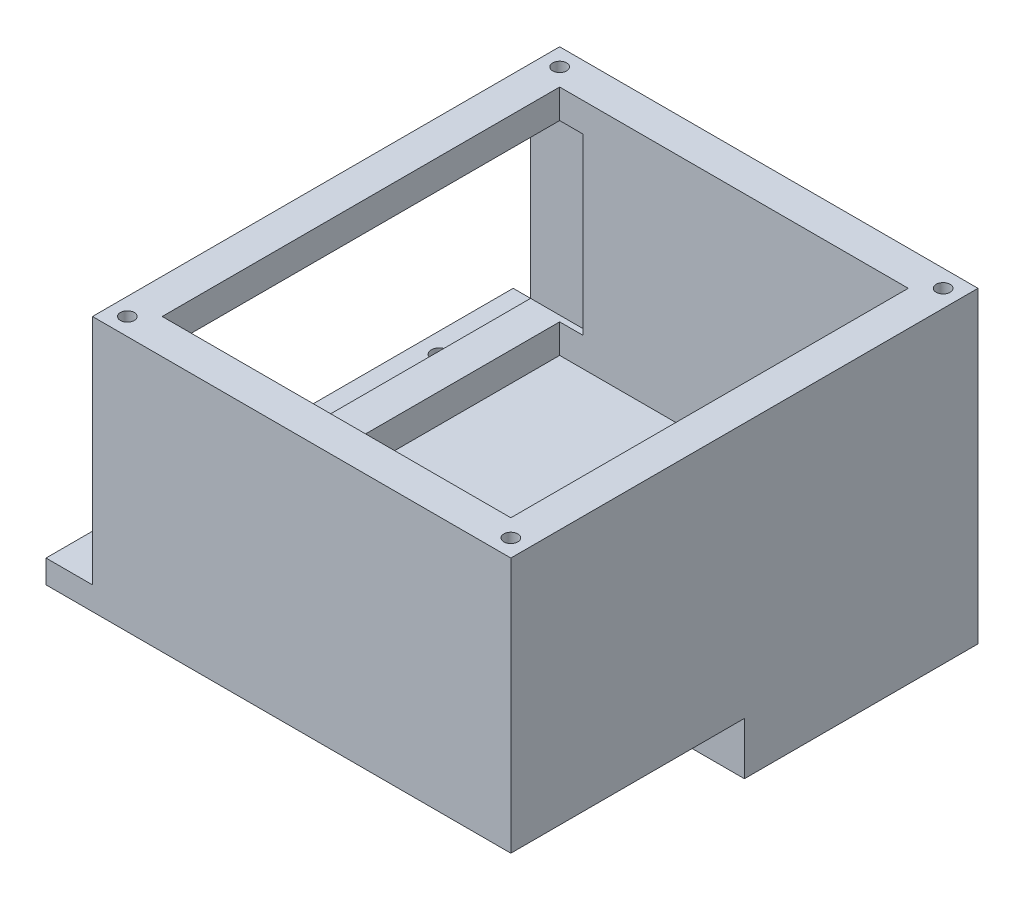
ISO-10303-21;
HEADER;
FILE_DESCRIPTION(('STEP AP214'),'2;1');
FILE_NAME('part.step','',(''),(''),'','','');
FILE_SCHEMA(('AUTOMOTIVE_DESIGN { 1 0 10303 214 1 1 1 1 }'));
ENDSEC;
DATA;
#1=APPLICATION_CONTEXT('core data for automotive mechanical design processes');
#2=APPLICATION_PROTOCOL_DEFINITION('international standard','automotive_design',2000,#1);
#3=PRODUCT_CONTEXT('',#1,'mechanical');
#4=PRODUCT('Part','Part','',(#3));
#5=PRODUCT_RELATED_PRODUCT_CATEGORY('part','',(#4));
#6=PRODUCT_DEFINITION_FORMATION('','',#4);
#7=PRODUCT_DEFINITION_CONTEXT('part definition',#1,'design');
#8=PRODUCT_DEFINITION('design','',#6,#7);
#9=PRODUCT_DEFINITION_SHAPE('','',#8);
#10=(LENGTH_UNIT() NAMED_UNIT(*) SI_UNIT(.MILLI.,.METRE.));
#11=(NAMED_UNIT(*) PLANE_ANGLE_UNIT() SI_UNIT($,.RADIAN.));
#12=(NAMED_UNIT(*) SI_UNIT($,.STERADIAN.) SOLID_ANGLE_UNIT());
#13=UNCERTAINTY_MEASURE_WITH_UNIT(LENGTH_MEASURE(1.E-05),#10,'distance_accuracy_value','');
#14=(GEOMETRIC_REPRESENTATION_CONTEXT(3) GLOBAL_UNCERTAINTY_ASSIGNED_CONTEXT((#13)) GLOBAL_UNIT_ASSIGNED_CONTEXT((#10,
#11,#12)) REPRESENTATION_CONTEXT('',''));
#15=CARTESIAN_POINT('',(0.,0.,0.));
#16=DIRECTION('',(0.,0.,1.));
#17=DIRECTION('',(1.,0.,0.));
#18=AXIS2_PLACEMENT_3D('',#15,#16,#17);
#19=CARTESIAN_POINT('',(0.,0.,0.));
#20=DIRECTION('',(0.,-1.,0.));
#21=DIRECTION('',(0.,0.,-1.));
#22=AXIS2_PLACEMENT_3D('',#19,#20,#21);
#23=PLANE('',#22);
#24=CARTESIAN_POINT('',(-36.5,0.,24.));
#25=DIRECTION('',(0.,-1.,0.));
#26=DIRECTION('',(0.,0.,-1.));
#27=AXIS2_PLACEMENT_3D('',#24,#25,#26);
#28=CIRCLE('',#27,1.375);
#29=CARTESIAN_POINT('',(-36.5,0.,22.625));
#30=VERTEX_POINT('',#29);
#31=EDGE_CURVE('E526',#30,#30,#28,.T.);
#32=ORIENTED_EDGE('',*,*,#31,.F.);
#33=EDGE_LOOP('',(#32));
#34=FACE_BOUND('',#33,.T.);
#35=CARTESIAN_POINT('',(-36.5,0.,-24.));
#36=DIRECTION('',(0.,-1.,0.));
#37=DIRECTION('',(0.,0.,-1.));
#38=AXIS2_PLACEMENT_3D('',#35,#36,#37);
#39=CIRCLE('',#38,1.375);
#40=CARTESIAN_POINT('',(-36.5,0.,-25.375));
#41=VERTEX_POINT('',#40);
#42=EDGE_CURVE('E521',#41,#41,#39,.T.);
#43=ORIENTED_EDGE('',*,*,#42,.F.);
#44=EDGE_LOOP('',(#43));
#45=FACE_BOUND('',#44,.T.);
#46=DIRECTION('',(-1.,0.,0.));
#47=VECTOR('',#46,1.);
#48=CARTESIAN_POINT('',(-40.,0.,-40.2));
#49=LINE('',#48,#47);
#50=CARTESIAN_POINT('',(-32.4,0.,-40.2));
#51=VERTEX_POINT('',#50);
#52=CARTESIAN_POINT('',(-40.,0.,-40.2));
#53=VERTEX_POINT('',#52);
#54=EDGE_CURVE('E576',#51,#53,#49,.T.);
#55=ORIENTED_EDGE('',*,*,#54,.F.);
#56=DIRECTION('',(0.,0.,1.));
#57=VECTOR('',#56,1.);
#58=CARTESIAN_POINT('',(-32.4,0.,-1.03129053738735E-13));
#59=LINE('',#58,#57);
#60=CARTESIAN_POINT('',(-32.4,0.,0.));
#61=VERTEX_POINT('',#60);
#62=EDGE_CURVE('E615',#51,#61,#59,.T.);
#63=ORIENTED_EDGE('',*,*,#62,.T.);
#64=DIRECTION('',(1.,0.,0.));
#65=VECTOR('',#64,1.);
#66=CARTESIAN_POINT('',(0.,0.,0.));
#67=LINE('',#66,#65);
#68=CARTESIAN_POINT('',(-32.,0.,0.));
#69=VERTEX_POINT('',#68);
#70=EDGE_CURVE('E612',#61,#69,#67,.T.);
#71=ORIENTED_EDGE('',*,*,#70,.T.);
#72=DIRECTION('',(0.,0.,1.));
#73=VECTOR('',#72,1.);
#74=CARTESIAN_POINT('',(-32.,0.,0.));
#75=LINE('',#74,#73);
#76=CARTESIAN_POINT('',(-32.,0.,35.2));
#77=VERTEX_POINT('',#76);
#78=EDGE_CURVE('E329',#69,#77,#75,.T.);
#79=ORIENTED_EDGE('',*,*,#78,.T.);
#80=DIRECTION('',(1.,0.,0.));
#81=VECTOR('',#80,1.);
#82=CARTESIAN_POINT('',(-27.,0.,35.2));
#83=LINE('',#82,#81);
#84=CARTESIAN_POINT('',(35.,0.,35.2));
#85=VERTEX_POINT('',#84);
#86=EDGE_CURVE('E492',#77,#85,#83,.T.);
#87=ORIENTED_EDGE('',*,*,#86,.T.);
#88=DIRECTION('',(0.,0.,-1.));
#89=VECTOR('',#88,1.);
#90=CARTESIAN_POINT('',(35.,0.,35.2));
#91=LINE('',#90,#89);
#92=CARTESIAN_POINT('',(35.,0.,0.));
#93=VERTEX_POINT('',#92);
#94=EDGE_CURVE('E497',#85,#93,#91,.T.);
#95=ORIENTED_EDGE('',*,*,#94,.T.);
#96=DIRECTION('',(-1.,0.,0.));
#97=VECTOR('',#96,1.);
#98=CARTESIAN_POINT('',(0.,0.,0.));
#99=LINE('',#98,#97);
#100=CARTESIAN_POINT('',(40.,0.,0.));
#101=VERTEX_POINT('',#100);
#102=EDGE_CURVE('E530',#101,#93,#99,.T.);
#103=ORIENTED_EDGE('',*,*,#102,.F.);
#104=DIRECTION('',(0.,0.,-1.));
#105=VECTOR('',#104,1.);
#106=CARTESIAN_POINT('',(40.,0.,40.2));
#107=LINE('',#106,#105);
#108=CARTESIAN_POINT('',(40.,0.,40.2));
#109=VERTEX_POINT('',#108);
#110=EDGE_CURVE('E560',#109,#101,#107,.T.);
#111=ORIENTED_EDGE('',*,*,#110,.F.);
#112=DIRECTION('',(1.,0.,0.));
#113=VECTOR('',#112,1.);
#114=CARTESIAN_POINT('',(-40.,0.,40.2));
#115=LINE('',#114,#113);
#116=CARTESIAN_POINT('',(-40.,0.,40.2));
#117=VERTEX_POINT('',#116);
#118=EDGE_CURVE('E565',#117,#109,#115,.T.);
#119=ORIENTED_EDGE('',*,*,#118,.F.);
#120=DIRECTION('',(0.,0.,1.));
#121=VECTOR('',#120,1.);
#122=CARTESIAN_POINT('',(-40.,0.,40.2));
#123=LINE('',#122,#121);
#124=EDGE_CURVE('E579',#53,#117,#123,.T.);
#125=ORIENTED_EDGE('',*,*,#124,.F.);
#126=EDGE_LOOP('',(#55,#63,#71,#79,#87,#95,#103,#111,#119,#125));
#127=FACE_BOUND('',#126,.T.);
#128=ADVANCED_FACE('F111',(#34,#45,#127),#23,.T.);
#129=CARTESIAN_POINT('',(0.,4.,0.));
#130=DIRECTION('',(0.,1.,0.));
#131=DIRECTION('',(0.,0.,1.));
#132=AXIS2_PLACEMENT_3D('',#129,#130,#131);
#133=PLANE('',#132);
#134=DIRECTION('',(0.,0.,1.));
#135=VECTOR('',#134,1.);
#136=CARTESIAN_POINT('',(-23.9814920279926,4.,0.));
#137=LINE('',#136,#135);
#138=CARTESIAN_POINT('',(-23.9814920279926,4.,34.2));
#139=VERTEX_POINT('',#138);
#140=CARTESIAN_POINT('',(-23.9814920279926,4.,35.2));
#141=VERTEX_POINT('',#140);
#142=EDGE_CURVE('E661',#139,#141,#137,.T.);
#143=ORIENTED_EDGE('',*,*,#142,.F.);
#144=DIRECTION('',(-1.,0.,0.));
#145=VECTOR('',#144,1.);
#146=CARTESIAN_POINT('',(34.,4.,34.2));
#147=LINE('',#146,#145);
#148=CARTESIAN_POINT('',(34.,4.,34.2));
#149=VERTEX_POINT('',#148);
#150=EDGE_CURVE('E413',#149,#139,#147,.T.);
#151=ORIENTED_EDGE('',*,*,#150,.F.);
#152=DIRECTION('',(0.,0.,1.));
#153=VECTOR('',#152,1.);
#154=CARTESIAN_POINT('',(34.,4.,34.2));
#155=LINE('',#154,#153);
#156=CARTESIAN_POINT('',(34.,4.,0.));
#157=VERTEX_POINT('',#156);
#158=EDGE_CURVE('E448',#157,#149,#155,.T.);
#159=ORIENTED_EDGE('',*,*,#158,.F.);
#160=DIRECTION('',(1.,0.,0.));
#161=VECTOR('',#160,1.);
#162=CARTESIAN_POINT('',(-27.,4.,0.));
#163=LINE('',#162,#161);
#164=CARTESIAN_POINT('',(35.,4.,0.));
#165=VERTEX_POINT('',#164);
#166=EDGE_CURVE('E501',#157,#165,#163,.T.);
#167=ORIENTED_EDGE('',*,*,#166,.T.);
#168=DIRECTION('',(0.,0.,-1.));
#169=VECTOR('',#168,1.);
#170=CARTESIAN_POINT('',(35.,4.,35.2));
#171=LINE('',#170,#169);
#172=CARTESIAN_POINT('',(35.,4.,35.2));
#173=VERTEX_POINT('',#172);
#174=EDGE_CURVE('E506',#173,#165,#171,.T.);
#175=ORIENTED_EDGE('',*,*,#174,.F.);
#176=DIRECTION('',(1.,0.,0.));
#177=VECTOR('',#176,1.);
#178=CARTESIAN_POINT('',(-27.,4.,35.2));
#179=LINE('',#178,#177);
#180=EDGE_CURVE('E510',#141,#173,#179,.T.);
#181=ORIENTED_EDGE('',*,*,#180,.F.);
#182=EDGE_LOOP('',(#143,#151,#159,#167,#175,#181));
#183=FACE_BOUND('',#182,.T.);
#184=ADVANCED_FACE('F716',(#183),#133,.F.);
#185=CARTESIAN_POINT('',(-32.,44.,40.2));
#186=DIRECTION('',(-1.,0.,0.));
#187=DIRECTION('',(0.,0.,1.));
#188=AXIS2_PLACEMENT_3D('',#185,#186,#187);
#189=PLANE('',#188);
#190=DIRECTION('',(0.,-1.,0.));
#191=VECTOR('',#190,1.);
#192=CARTESIAN_POINT('',(-32.,44.,-40.2));
#193=LINE('',#192,#191);
#194=CARTESIAN_POINT('',(-32.,44.,-40.2));
#195=VERTEX_POINT('',#194);
#196=CARTESIAN_POINT('',(-32.,6.4,-40.2));
#197=VERTEX_POINT('',#196);
#198=EDGE_CURVE('E489',#195,#197,#193,.T.);
#199=ORIENTED_EDGE('',*,*,#198,.T.);
#200=DIRECTION('',(0.,0.,-1.));
#201=VECTOR('',#200,1.);
#202=CARTESIAN_POINT('',(-32.,6.4,40.2));
#203=LINE('',#202,#201);
#204=CARTESIAN_POINT('',(-32.,6.4,0.));
#205=VERTEX_POINT('',#204);
#206=EDGE_CURVE('E315',#197,#205,#203,.F.);
#207=ORIENTED_EDGE('',*,*,#206,.T.);
#208=DIRECTION('',(0.,1.,0.));
#209=VECTOR('',#208,1.);
#210=CARTESIAN_POINT('',(-32.,-8.,0.));
#211=LINE('',#210,#209);
#212=CARTESIAN_POINT('',(-32.,9.,0.));
#213=VERTEX_POINT('',#212);
#214=EDGE_CURVE('E308',#205,#213,#211,.T.);
#215=ORIENTED_EDGE('',*,*,#214,.T.);
#216=DIRECTION('',(0.,0.,1.));
#217=VECTOR('',#216,1.);
#218=CARTESIAN_POINT('',(-32.,9.,-35.2));
#219=LINE('',#218,#217);
#220=CARTESIAN_POINT('',(-32.,9.,-35.2));
#221=VERTEX_POINT('',#220);
#222=EDGE_CURVE('E313',#221,#213,#219,.T.);
#223=ORIENTED_EDGE('',*,*,#222,.F.);
#224=DIRECTION('',(0.,-1.,0.));
#225=VECTOR('',#224,1.);
#226=CARTESIAN_POINT('',(-32.,39.,-35.2));
#227=LINE('',#226,#225);
#228=CARTESIAN_POINT('',(-32.,39.,-35.2));
#229=VERTEX_POINT('',#228);
#230=EDGE_CURVE('E338',#229,#221,#227,.T.);
#231=ORIENTED_EDGE('',*,*,#230,.F.);
#232=DIRECTION('',(0.,0.,-1.));
#233=VECTOR('',#232,1.);
#234=CARTESIAN_POINT('',(-32.,39.,35.2));
#235=LINE('',#234,#233);
#236=CARTESIAN_POINT('',(-32.,39.,35.2));
#237=VERTEX_POINT('',#236);
#238=EDGE_CURVE('E343',#237,#229,#235,.T.);
#239=ORIENTED_EDGE('',*,*,#238,.F.);
#240=DIRECTION('',(0.,1.,0.));
#241=VECTOR('',#240,1.);
#242=CARTESIAN_POINT('',(-32.,9.,35.2));
#243=LINE('',#242,#241);
#244=CARTESIAN_POINT('',(-32.,4.,35.2));
#245=VERTEX_POINT('',#244);
#246=EDGE_CURVE('E337',#245,#237,#243,.T.);
#247=ORIENTED_EDGE('',*,*,#246,.F.);
#248=DIRECTION('',(0.,0.,-1.));
#249=VECTOR('',#248,1.);
#250=CARTESIAN_POINT('',(-32.,4.,40.2));
#251=LINE('',#250,#249);
#252=CARTESIAN_POINT('',(-32.,4.,40.2));
#253=VERTEX_POINT('',#252);
#254=EDGE_CURVE('E456',#253,#245,#251,.T.);
#255=ORIENTED_EDGE('',*,*,#254,.F.);
#256=DIRECTION('',(0.,-1.,0.));
#257=VECTOR('',#256,1.);
#258=CARTESIAN_POINT('',(-32.,44.,40.2));
#259=LINE('',#258,#257);
#260=CARTESIAN_POINT('',(-32.,44.,40.2));
#261=VERTEX_POINT('',#260);
#262=EDGE_CURVE('E485',#261,#253,#259,.T.);
#263=ORIENTED_EDGE('',*,*,#262,.F.);
#264=DIRECTION('',(0.,0.,-1.));
#265=VECTOR('',#264,1.);
#266=CARTESIAN_POINT('',(-32.,44.,40.2));
#267=LINE('',#266,#265);
#268=EDGE_CURVE('E477',#261,#195,#267,.T.);
#269=ORIENTED_EDGE('',*,*,#268,.T.);
#270=EDGE_LOOP('',(#199,#207,#215,#223,#231,#239,#247,#255,#263,#269));
#271=FACE_BOUND('',#270,.T.);
#272=ADVANCED_FACE('F310',(#271),#189,.T.);
#273=CARTESIAN_POINT('',(34.,44.,34.2));
#274=DIRECTION('',(0.,0.,1.));
#275=DIRECTION('',(1.,0.,0.));
#276=AXIS2_PLACEMENT_3D('',#273,#274,#275);
#277=PLANE('',#276);
#278=DIRECTION('',(0.,-1.,0.));
#279=VECTOR('',#278,1.);
#280=CARTESIAN_POINT('',(-23.9814920279926,44.,34.2));
#281=LINE('',#280,#279);
#282=CARTESIAN_POINT('',(-23.9814920279926,9.,34.2));
#283=VERTEX_POINT('',#282);
#284=EDGE_CURVE('E664',#283,#139,#281,.T.);
#285=ORIENTED_EDGE('',*,*,#284,.F.);
#286=DIRECTION('',(1.,0.,0.));
#287=VECTOR('',#286,1.);
#288=CARTESIAN_POINT('',(34.,9.,34.2));
#289=LINE('',#288,#287);
#290=CARTESIAN_POINT('',(-22.,9.,34.2));
#291=VERTEX_POINT('',#290);
#292=EDGE_CURVE('E369',#283,#291,#289,.T.);
#293=ORIENTED_EDGE('',*,*,#292,.T.);
#294=DIRECTION('',(0.,-1.,0.));
#295=VECTOR('',#294,1.);
#296=CARTESIAN_POINT('',(-22.,44.,34.2));
#297=LINE('',#296,#295);
#298=CARTESIAN_POINT('',(-22.,39.,34.2));
#299=VERTEX_POINT('',#298);
#300=EDGE_CURVE('E380',#299,#291,#297,.T.);
#301=ORIENTED_EDGE('',*,*,#300,.F.);
#302=DIRECTION('',(-1.,0.,0.));
#303=VECTOR('',#302,1.);
#304=CARTESIAN_POINT('',(34.,39.,34.2));
#305=LINE('',#304,#303);
#306=CARTESIAN_POINT('',(-26.,39.,34.2));
#307=VERTEX_POINT('',#306);
#308=EDGE_CURVE('E376',#299,#307,#305,.T.);
#309=ORIENTED_EDGE('',*,*,#308,.T.);
#310=DIRECTION('',(0.,-1.,0.));
#311=VECTOR('',#310,1.);
#312=CARTESIAN_POINT('',(-26.,44.,34.2));
#313=LINE('',#312,#311);
#314=CARTESIAN_POINT('',(-26.,44.,34.2));
#315=VERTEX_POINT('',#314);
#316=EDGE_CURVE('E434',#315,#307,#313,.T.);
#317=ORIENTED_EDGE('',*,*,#316,.F.);
#318=DIRECTION('',(-1.,0.,0.));
#319=VECTOR('',#318,1.);
#320=CARTESIAN_POINT('',(34.,44.,34.2));
#321=LINE('',#320,#319);
#322=CARTESIAN_POINT('',(34.,44.,34.2));
#323=VERTEX_POINT('',#322);
#324=EDGE_CURVE('E417',#323,#315,#321,.T.);
#325=ORIENTED_EDGE('',*,*,#324,.F.);
#326=DIRECTION('',(0.,-1.,0.));
#327=VECTOR('',#326,1.);
#328=CARTESIAN_POINT('',(34.,44.,34.2));
#329=LINE('',#328,#327);
#330=EDGE_CURVE('E452',#323,#149,#329,.T.);
#331=ORIENTED_EDGE('',*,*,#330,.T.);
#332=ORIENTED_EDGE('',*,*,#150,.T.);
#333=EDGE_LOOP('',(#285,#293,#301,#309,#317,#325,#331,#332));
#334=FACE_BOUND('',#333,.T.);
#335=ADVANCED_FACE('F701',(#334),#277,.F.);
#336=CARTESIAN_POINT('',(-26.,44.,34.2));
#337=DIRECTION('',(-1.,0.,0.));
#338=DIRECTION('',(0.,0.,1.));
#339=AXIS2_PLACEMENT_3D('',#336,#337,#338);
#340=PLANE('',#339);
#341=DIRECTION('',(0.,1.,0.));
#342=VECTOR('',#341,1.);
#343=CARTESIAN_POINT('',(-26.,44.,0.));
#344=LINE('',#343,#342);
#345=CARTESIAN_POINT('',(-26.,4.,0.));
#346=VERTEX_POINT('',#345);
#347=CARTESIAN_POINT('',(-26.,9.,0.));
#348=VERTEX_POINT('',#347);
#349=EDGE_CURVE('E325',#346,#348,#344,.T.);
#350=ORIENTED_EDGE('',*,*,#349,.F.);
#351=DIRECTION('',(0.,0.,-1.));
#352=VECTOR('',#351,1.);
#353=CARTESIAN_POINT('',(-26.,4.,34.2));
#354=LINE('',#353,#352);
#355=CARTESIAN_POINT('',(-26.,4.,-34.2));
#356=VERTEX_POINT('',#355);
#357=EDGE_CURVE('E439',#346,#356,#354,.T.);
#358=ORIENTED_EDGE('',*,*,#357,.T.);
#359=DIRECTION('',(0.,-1.,0.));
#360=VECTOR('',#359,1.);
#361=CARTESIAN_POINT('',(-26.,44.,-34.2));
#362=LINE('',#361,#360);
#363=CARTESIAN_POINT('',(-26.,9.,-34.2));
#364=VERTEX_POINT('',#363);
#365=EDGE_CURVE('E465',#364,#356,#362,.T.);
#366=ORIENTED_EDGE('',*,*,#365,.F.);
#367=DIRECTION('',(0.,0.,1.));
#368=VECTOR('',#367,1.);
#369=CARTESIAN_POINT('',(-26.,9.,34.2));
#370=LINE('',#369,#368);
#371=EDGE_CURVE('E443',#364,#348,#370,.T.);
#372=ORIENTED_EDGE('',*,*,#371,.T.);
#373=EDGE_LOOP('',(#350,#358,#366,#372));
#374=FACE_BOUND('',#373,.T.);
#375=ADVANCED_FACE('F824',(#374),#340,.F.);
#376=CARTESIAN_POINT('',(-22.,9.,-35.2));
#377=DIRECTION('',(0.,-1.,0.));
#378=DIRECTION('',(0.,0.,-1.));
#379=AXIS2_PLACEMENT_3D('',#376,#377,#378);
#380=PLANE('',#379);
#381=DIRECTION('',(1.,0.,0.));
#382=VECTOR('',#381,1.);
#383=CARTESIAN_POINT('',(0.,9.,0.));
#384=LINE('',#383,#382);
#385=EDGE_CURVE('E322',#213,#348,#384,.T.);
#386=ORIENTED_EDGE('',*,*,#385,.T.);
#387=ORIENTED_EDGE('',*,*,#371,.F.);
#388=DIRECTION('',(-1.,0.,0.));
#389=VECTOR('',#388,1.);
#390=CARTESIAN_POINT('',(34.,9.,-34.2));
#391=LINE('',#390,#389);
#392=CARTESIAN_POINT('',(-22.,9.,-34.2));
#393=VERTEX_POINT('',#392);
#394=EDGE_CURVE('E355',#393,#364,#391,.T.);
#395=ORIENTED_EDGE('',*,*,#394,.F.);
#396=DIRECTION('',(0.,0.,1.));
#397=VECTOR('',#396,1.);
#398=CARTESIAN_POINT('',(-22.,9.,-35.2));
#399=LINE('',#398,#397);
#400=CARTESIAN_POINT('',(-22.,9.,-35.2));
#401=VERTEX_POINT('',#400);
#402=EDGE_CURVE('E647',#401,#393,#399,.T.);
#403=ORIENTED_EDGE('',*,*,#402,.F.);
#404=DIRECTION('',(-1.,0.,0.));
#405=VECTOR('',#404,1.);
#406=CARTESIAN_POINT('',(-22.,9.,-35.2));
#407=LINE('',#406,#405);
#408=EDGE_CURVE('E335',#401,#221,#407,.T.);
#409=ORIENTED_EDGE('',*,*,#408,.T.);
#410=ORIENTED_EDGE('',*,*,#222,.T.);
#411=EDGE_LOOP('',(#386,#387,#395,#403,#409,#410));
#412=FACE_BOUND('',#411,.T.);
#413=ADVANCED_FACE('F333',(#412),#380,.F.);
#414=DIRECTION('',(0.,0.,1.));
#415=VECTOR('',#414,1.);
#416=CARTESIAN_POINT('',(-23.9814920279926,9.,0.));
#417=LINE('',#416,#415);
#418=CARTESIAN_POINT('',(-23.9814920279926,9.,35.2));
#419=VERTEX_POINT('',#418);
#420=EDGE_CURVE('E330',#283,#419,#417,.T.);
#421=ORIENTED_EDGE('',*,*,#420,.T.);
#422=DIRECTION('',(-1.,0.,0.));
#423=VECTOR('',#422,1.);
#424=CARTESIAN_POINT('',(-22.,9.,35.2));
#425=LINE('',#424,#423);
#426=CARTESIAN_POINT('',(-22.,9.,35.2));
#427=VERTEX_POINT('',#426);
#428=EDGE_CURVE('E359',#427,#419,#425,.T.);
#429=ORIENTED_EDGE('',*,*,#428,.F.);
#430=EDGE_CURVE('E651',#291,#427,#399,.T.);
#431=ORIENTED_EDGE('',*,*,#430,.F.);
#432=ORIENTED_EDGE('',*,*,#292,.F.);
#433=EDGE_LOOP('',(#421,#429,#431,#432));
#434=FACE_BOUND('',#433,.T.);
#435=ADVANCED_FACE('F685',(#434),#380,.F.);
#436=ORIENTED_EDGE('',*,*,#316,.T.);
#437=DIRECTION('',(0.,0.,-1.));
#438=VECTOR('',#437,1.);
#439=CARTESIAN_POINT('',(-26.,39.,34.2));
#440=LINE('',#439,#438);
#441=CARTESIAN_POINT('',(-26.,39.,-34.2));
#442=VERTEX_POINT('',#441);
#443=EDGE_CURVE('E605',#307,#442,#440,.T.);
#444=ORIENTED_EDGE('',*,*,#443,.T.);
#445=CARTESIAN_POINT('',(-26.,44.,-34.2));
#446=VERTEX_POINT('',#445);
#447=EDGE_CURVE('E461',#446,#442,#362,.T.);
#448=ORIENTED_EDGE('',*,*,#447,.F.);
#449=DIRECTION('',(0.,0.,-1.));
#450=VECTOR('',#449,1.);
#451=CARTESIAN_POINT('',(-26.,44.,34.2));
#452=LINE('',#451,#450);
#453=EDGE_CURVE('E421',#315,#446,#452,.T.);
#454=ORIENTED_EDGE('',*,*,#453,.F.);
#455=EDGE_LOOP('',(#436,#444,#448,#454));
#456=FACE_BOUND('',#455,.T.);
#457=ADVANCED_FACE('F705',(#456),#340,.F.);
#458=CARTESIAN_POINT('',(0.,4.,0.));
#459=DIRECTION('',(0.,-1.,0.));
#460=DIRECTION('',(0.,0.,-1.));
#461=AXIS2_PLACEMENT_3D('',#458,#459,#460);
#462=PLANE('',#461);
#463=ORIENTED_EDGE('',*,*,#357,.F.);
#464=EDGE_CURVE('E505',#346,#157,#163,.T.);
#465=ORIENTED_EDGE('',*,*,#464,.T.);
#466=CARTESIAN_POINT('',(34.,4.,-34.2));
#467=VERTEX_POINT('',#466);
#468=EDGE_CURVE('E422',#467,#157,#155,.T.);
#469=ORIENTED_EDGE('',*,*,#468,.F.);
#470=DIRECTION('',(1.,0.,0.));
#471=VECTOR('',#470,1.);
#472=CARTESIAN_POINT('',(34.,4.,-34.2));
#473=LINE('',#472,#471);
#474=EDGE_CURVE('E438',#356,#467,#473,.T.);
#475=ORIENTED_EDGE('',*,*,#474,.F.);
#476=EDGE_LOOP('',(#463,#465,#469,#475));
#477=FACE_BOUND('',#476,.T.);
#478=ADVANCED_FACE('F979',(#477),#462,.F.);
#479=DIRECTION('',(-1.,0.,0.));
#480=VECTOR('',#479,1.);
#481=CARTESIAN_POINT('',(0.,4.,0.));
#482=LINE('',#481,#480);
#483=CARTESIAN_POINT('',(-32.,4.,0.));
#484=VERTEX_POINT('',#483);
#485=CARTESIAN_POINT('',(-34.4,4.,0.));
#486=VERTEX_POINT('',#485);
#487=EDGE_CURVE('E126',#484,#486,#482,.T.);
#488=ORIENTED_EDGE('',*,*,#487,.T.);
#489=DIRECTION('',(0.,0.,-1.));
#490=VECTOR('',#489,1.);
#491=CARTESIAN_POINT('',(-34.4,4.,0.));
#492=LINE('',#491,#490);
#493=CARTESIAN_POINT('',(-34.4,4.,-40.2));
#494=VERTEX_POINT('',#493);
#495=EDGE_CURVE('E624',#486,#494,#492,.T.);
#496=ORIENTED_EDGE('',*,*,#495,.T.);
#497=DIRECTION('',(-1.,0.,0.));
#498=VECTOR('',#497,1.);
#499=CARTESIAN_POINT('',(-40.,4.,-40.2));
#500=LINE('',#499,#498);
#501=CARTESIAN_POINT('',(-40.,4.,-40.2));
#502=VERTEX_POINT('',#501);
#503=EDGE_CURVE('E561',#494,#502,#500,.T.);
#504=ORIENTED_EDGE('',*,*,#503,.T.);
#505=DIRECTION('',(0.,0.,1.));
#506=VECTOR('',#505,1.);
#507=CARTESIAN_POINT('',(-40.,4.,40.2));
#508=LINE('',#507,#506);
#509=CARTESIAN_POINT('',(-40.,4.,40.2));
#510=VERTEX_POINT('',#509);
#511=EDGE_CURVE('E564',#502,#510,#508,.T.);
#512=ORIENTED_EDGE('',*,*,#511,.T.);
#513=DIRECTION('',(1.,0.,0.));
#514=VECTOR('',#513,1.);
#515=CARTESIAN_POINT('',(-40.,4.,40.2));
#516=LINE('',#515,#514);
#517=EDGE_CURVE('E568',#510,#253,#516,.T.);
#518=ORIENTED_EDGE('',*,*,#517,.T.);
#519=ORIENTED_EDGE('',*,*,#254,.T.);
#520=DIRECTION('',(0.,0.,1.));
#521=VECTOR('',#520,1.);
#522=CARTESIAN_POINT('',(-32.,4.,0.));
#523=LINE('',#522,#521);
#524=EDGE_CURVE('E667',#484,#245,#523,.T.);
#525=ORIENTED_EDGE('',*,*,#524,.F.);
#526=EDGE_LOOP('',(#488,#496,#504,#512,#518,#519,#525));
#527=FACE_BOUND('',#526,.T.);
#528=CARTESIAN_POINT('',(-36.5,4.,-24.));
#529=DIRECTION('',(0.,-1.,0.));
#530=DIRECTION('',(0.,0.,-1.));
#531=AXIS2_PLACEMENT_3D('',#528,#529,#530);
#532=CIRCLE('',#531,1.375);
#533=CARTESIAN_POINT('',(-36.5,4.,-25.375));
#534=VERTEX_POINT('',#533);
#535=EDGE_CURVE('E520',#534,#534,#532,.T.);
#536=ORIENTED_EDGE('',*,*,#535,.T.);
#537=EDGE_LOOP('',(#536));
#538=FACE_BOUND('',#537,.T.);
#539=CARTESIAN_POINT('',(-36.5,4.,24.));
#540=DIRECTION('',(0.,-1.,0.));
#541=DIRECTION('',(0.,0.,-1.));
#542=AXIS2_PLACEMENT_3D('',#539,#540,#541);
#543=CIRCLE('',#542,1.375);
#544=CARTESIAN_POINT('',(-36.5,4.,22.625));
#545=VERTEX_POINT('',#544);
#546=EDGE_CURVE('E525',#545,#545,#543,.T.);
#547=ORIENTED_EDGE('',*,*,#546,.T.);
#548=EDGE_LOOP('',(#547));
#549=FACE_BOUND('',#548,.T.);
#550=ADVANCED_FACE('F743',(#527,#538,#549),#462,.F.);
#551=CARTESIAN_POINT('',(40.,4.,40.2));
#552=DIRECTION('',(-1.,0.,0.));
#553=DIRECTION('',(0.,0.,1.));
#554=AXIS2_PLACEMENT_3D('',#551,#552,#553);
#555=PLANE('',#554);
#556=ORIENTED_EDGE('',*,*,#110,.T.);
#557=DIRECTION('',(0.,1.,0.));
#558=VECTOR('',#557,1.);
#559=CARTESIAN_POINT('',(40.,-9.,0.));
#560=LINE('',#559,#558);
#561=CARTESIAN_POINT('',(40.,-9.,0.));
#562=VERTEX_POINT('',#561);
#563=EDGE_CURVE('E552',#562,#101,#560,.T.);
#564=ORIENTED_EDGE('',*,*,#563,.F.);
#565=DIRECTION('',(0.,0.,1.));
#566=VECTOR('',#565,1.);
#567=CARTESIAN_POINT('',(40.,-9.,0.));
#568=LINE('',#567,#566);
#569=CARTESIAN_POINT('',(40.,-9.,-40.2));
#570=VERTEX_POINT('',#569);
#571=EDGE_CURVE('E539',#570,#562,#568,.T.);
#572=ORIENTED_EDGE('',*,*,#571,.F.);
#573=DIRECTION('',(0.,-1.,0.));
#574=VECTOR('',#573,1.);
#575=CARTESIAN_POINT('',(40.,4.,-40.2));
#576=LINE('',#575,#574);
#577=CARTESIAN_POINT('',(40.,44.,-40.2));
#578=VERTEX_POINT('',#577);
#579=EDGE_CURVE('E444',#578,#570,#576,.T.);
#580=ORIENTED_EDGE('',*,*,#579,.F.);
#581=DIRECTION('',(0.,0.,1.));
#582=VECTOR('',#581,1.);
#583=CARTESIAN_POINT('',(40.,44.,40.2));
#584=LINE('',#583,#582);
#585=CARTESIAN_POINT('',(40.,44.,40.2));
#586=VERTEX_POINT('',#585);
#587=EDGE_CURVE('E469',#578,#586,#584,.T.);
#588=ORIENTED_EDGE('',*,*,#587,.T.);
#589=DIRECTION('',(0.,-1.,0.));
#590=VECTOR('',#589,1.);
#591=CARTESIAN_POINT('',(40.,4.,40.2));
#592=LINE('',#591,#590);
#593=EDGE_CURVE('E572',#586,#109,#592,.T.);
#594=ORIENTED_EDGE('',*,*,#593,.T.);
#595=EDGE_LOOP('',(#556,#564,#572,#580,#588,#594));
#596=FACE_BOUND('',#595,.T.);
#597=ADVANCED_FACE('F757',(#596),#555,.F.);
#598=CARTESIAN_POINT('',(-40.,4.,-40.2));
#599=DIRECTION('',(0.,0.,1.));
#600=DIRECTION('',(1.,0.,0.));
#601=AXIS2_PLACEMENT_3D('',#598,#599,#600);
#602=PLANE('',#601);
#603=ORIENTED_EDGE('',*,*,#579,.T.);
#604=DIRECTION('',(1.,0.,0.));
#605=VECTOR('',#604,1.);
#606=CARTESIAN_POINT('',(0.,-9.,-40.2));
#607=LINE('',#606,#605);
#608=CARTESIAN_POINT('',(-30.,-9.,-40.2));
#609=VERTEX_POINT('',#608);
#610=EDGE_CURVE('E535',#609,#570,#607,.T.);
#611=ORIENTED_EDGE('',*,*,#610,.F.);
#612=DIRECTION('',(0.,1.,0.));
#613=VECTOR('',#612,1.);
#614=CARTESIAN_POINT('',(-30.,-9.,-40.2));
#615=LINE('',#614,#613);
#616=CARTESIAN_POINT('',(-30.,-2.4,-40.2));
#617=VERTEX_POINT('',#616);
#618=EDGE_CURVE('E556',#609,#617,#615,.T.);
#619=ORIENTED_EDGE('',*,*,#618,.T.);
#620=CARTESIAN_POINT('',(-32.4,-2.4,-40.2));
#621=DIRECTION('',(0.,0.,1.));
#622=DIRECTION('',(1.,0.,0.));
#623=AXIS2_PLACEMENT_3D('',#620,#621,#622);
#624=CIRCLE('',#623,2.4);
#625=EDGE_CURVE('E633',#617,#51,#624,.T.);
#626=ORIENTED_EDGE('',*,*,#625,.T.);
#627=ORIENTED_EDGE('',*,*,#54,.T.);
#628=DIRECTION('',(0.,-1.,0.));
#629=VECTOR('',#628,1.);
#630=CARTESIAN_POINT('',(-40.,4.,-40.2));
#631=LINE('',#630,#629);
#632=EDGE_CURVE('E591',#502,#53,#631,.T.);
#633=ORIENTED_EDGE('',*,*,#632,.F.);
#634=ORIENTED_EDGE('',*,*,#503,.F.);
#635=CARTESIAN_POINT('',(-34.4,6.4,-40.2));
#636=DIRECTION('',(0.,0.,1.));
#637=DIRECTION('',(1.,0.,0.));
#638=AXIS2_PLACEMENT_3D('',#635,#636,#637);
#639=CIRCLE('',#638,2.4);
#640=EDGE_CURVE('E120',#494,#197,#639,.T.);
#641=ORIENTED_EDGE('',*,*,#640,.T.);
#642=ORIENTED_EDGE('',*,*,#198,.F.);
#643=DIRECTION('',(1.,0.,0.));
#644=VECTOR('',#643,1.);
#645=CARTESIAN_POINT('',(40.,44.,-40.2));
#646=LINE('',#645,#644);
#647=EDGE_CURVE('E481',#195,#578,#646,.T.);
#648=ORIENTED_EDGE('',*,*,#647,.T.);
#649=EDGE_LOOP('',(#603,#611,#619,#626,#627,#633,#634,#641,#642,#648));
#650=FACE_BOUND('',#649,.T.);
#651=ADVANCED_FACE('F753',(#650),#602,.F.);
#652=CARTESIAN_POINT('',(-40.,4.,40.2));
#653=DIRECTION('',(1.,0.,0.));
#654=DIRECTION('',(0.,0.,-1.));
#655=AXIS2_PLACEMENT_3D('',#652,#653,#654);
#656=PLANE('',#655);
#657=ORIENTED_EDGE('',*,*,#124,.T.);
#658=DIRECTION('',(0.,-1.,0.));
#659=VECTOR('',#658,1.);
#660=CARTESIAN_POINT('',(-40.,4.,40.2));
#661=LINE('',#660,#659);
#662=EDGE_CURVE('E587',#510,#117,#661,.T.);
#663=ORIENTED_EDGE('',*,*,#662,.F.);
#664=ORIENTED_EDGE('',*,*,#511,.F.);
#665=ORIENTED_EDGE('',*,*,#632,.T.);
#666=EDGE_LOOP('',(#657,#663,#664,#665));
#667=FACE_BOUND('',#666,.T.);
#668=ADVANCED_FACE('F749',(#667),#656,.F.);
#669=CARTESIAN_POINT('',(-40.,4.,40.2));
#670=DIRECTION('',(0.,0.,-1.));
#671=DIRECTION('',(-1.,0.,0.));
#672=AXIS2_PLACEMENT_3D('',#669,#670,#671);
#673=PLANE('',#672);
#674=ORIENTED_EDGE('',*,*,#118,.T.);
#675=ORIENTED_EDGE('',*,*,#593,.F.);
#676=DIRECTION('',(-1.,0.,0.));
#677=VECTOR('',#676,1.);
#678=CARTESIAN_POINT('',(40.,44.,40.2));
#679=LINE('',#678,#677);
#680=EDGE_CURVE('E473',#586,#261,#679,.T.);
#681=ORIENTED_EDGE('',*,*,#680,.T.);
#682=ORIENTED_EDGE('',*,*,#262,.T.);
#683=ORIENTED_EDGE('',*,*,#517,.F.);
#684=ORIENTED_EDGE('',*,*,#662,.T.);
#685=EDGE_LOOP('',(#674,#675,#681,#682,#683,#684));
#686=FACE_BOUND('',#685,.T.);
#687=ADVANCED_FACE('F745',(#686),#673,.F.);
#688=CARTESIAN_POINT('',(-30.,-9.,0.));
#689=DIRECTION('',(-1.,0.,0.));
#690=DIRECTION('',(0.,0.,1.));
#691=AXIS2_PLACEMENT_3D('',#688,#689,#690);
#692=PLANE('',#691);
#693=DIRECTION('',(0.,1.,0.));
#694=VECTOR('',#693,1.);
#695=CARTESIAN_POINT('',(-30.,-9.,0.));
#696=LINE('',#695,#694);
#697=CARTESIAN_POINT('',(-30.,-9.,0.));
#698=VERTEX_POINT('',#697);
#699=CARTESIAN_POINT('',(-30.,-2.4,0.));
#700=VERTEX_POINT('',#699);
#701=EDGE_CURVE('E545',#698,#700,#696,.T.);
#702=ORIENTED_EDGE('',*,*,#701,.T.);
#703=DIRECTION('',(0.,0.,1.));
#704=VECTOR('',#703,1.);
#705=CARTESIAN_POINT('',(-30.,-2.4,-40.2));
#706=LINE('',#705,#704);
#707=EDGE_CURVE('E619',#700,#617,#706,.F.);
#708=ORIENTED_EDGE('',*,*,#707,.T.);
#709=ORIENTED_EDGE('',*,*,#618,.F.);
#710=DIRECTION('',(0.,0.,1.));
#711=VECTOR('',#710,1.);
#712=CARTESIAN_POINT('',(-30.,-9.,0.));
#713=LINE('',#712,#711);
#714=EDGE_CURVE('E531',#609,#698,#713,.T.);
#715=ORIENTED_EDGE('',*,*,#714,.T.);
#716=EDGE_LOOP('',(#702,#708,#709,#715));
#717=FACE_BOUND('',#716,.T.);
#718=ADVANCED_FACE('F748',(#717),#692,.T.);
#719=CARTESIAN_POINT('',(0.,-9.,0.));
#720=DIRECTION('',(0.,0.,-1.));
#721=DIRECTION('',(-1.,0.,0.));
#722=AXIS2_PLACEMENT_3D('',#719,#720,#721);
#723=PLANE('',#722);
#724=EDGE_CURVE('E318',#69,#484,#211,.T.);
#725=ORIENTED_EDGE('',*,*,#724,.F.);
#726=ORIENTED_EDGE('',*,*,#70,.F.);
#727=CARTESIAN_POINT('',(-32.4,-2.4,0.));
#728=DIRECTION('',(0.,0.,-1.));
#729=DIRECTION('',(-1.,0.,0.));
#730=AXIS2_PLACEMENT_3D('',#727,#728,#729);
#731=CIRCLE('',#730,2.4);
#732=EDGE_CURVE('E630',#61,#700,#731,.T.);
#733=ORIENTED_EDGE('',*,*,#732,.T.);
#734=ORIENTED_EDGE('',*,*,#701,.F.);
#735=DIRECTION('',(-1.,0.,0.));
#736=VECTOR('',#735,1.);
#737=CARTESIAN_POINT('',(0.,-9.,0.));
#738=LINE('',#737,#736);
#739=EDGE_CURVE('E542',#562,#698,#738,.T.);
#740=ORIENTED_EDGE('',*,*,#739,.F.);
#741=ORIENTED_EDGE('',*,*,#563,.T.);
#742=ORIENTED_EDGE('',*,*,#102,.T.);
#743=DIRECTION('',(0.,1.,0.));
#744=VECTOR('',#743,1.);
#745=CARTESIAN_POINT('',(35.,-9.001,0.));
#746=LINE('',#745,#744);
#747=EDGE_CURVE('E517',#93,#165,#746,.T.);
#748=ORIENTED_EDGE('',*,*,#747,.T.);
#749=ORIENTED_EDGE('',*,*,#166,.F.);
#750=ORIENTED_EDGE('',*,*,#464,.F.);
#751=ORIENTED_EDGE('',*,*,#349,.T.);
#752=ORIENTED_EDGE('',*,*,#385,.F.);
#753=ORIENTED_EDGE('',*,*,#214,.F.);
#754=CARTESIAN_POINT('',(-34.4,6.4,0.));
#755=DIRECTION('',(0.,0.,-1.));
#756=DIRECTION('',(-1.,0.,0.));
#757=AXIS2_PLACEMENT_3D('',#754,#755,#756);
#758=CIRCLE('',#757,2.4);
#759=EDGE_CURVE('E12',#205,#486,#758,.T.);
#760=ORIENTED_EDGE('',*,*,#759,.T.);
#761=ORIENTED_EDGE('',*,*,#487,.F.);
#762=EDGE_LOOP('',(#725,#726,#733,#734,#740,#741,#742,#748,#749,#750,#751,#752,#753,#760,#761));
#763=FACE_BOUND('',#762,.T.);
#764=ADVANCED_FACE('F323',(#763),#723,.F.);
#765=CARTESIAN_POINT('',(0.,-9.,0.));
#766=DIRECTION('',(0.,-1.,0.));
#767=DIRECTION('',(0.,0.,-1.));
#768=AXIS2_PLACEMENT_3D('',#765,#766,#767);
#769=PLANE('',#768);
#770=ORIENTED_EDGE('',*,*,#714,.F.);
#771=ORIENTED_EDGE('',*,*,#610,.T.);
#772=ORIENTED_EDGE('',*,*,#571,.T.);
#773=ORIENTED_EDGE('',*,*,#739,.T.);
#774=EDGE_LOOP('',(#770,#771,#772,#773));
#775=FACE_BOUND('',#774,.T.);
#776=ADVANCED_FACE('F843',(#775),#769,.T.);
#777=CARTESIAN_POINT('',(-36.5,10.,-24.));
#778=DIRECTION('',(0.,-1.,0.));
#779=DIRECTION('',(0.,0.,-1.));
#780=AXIS2_PLACEMENT_3D('',#777,#778,#779);
#781=CYLINDRICAL_SURFACE('',#780,1.375);
#782=ORIENTED_EDGE('',*,*,#42,.T.);
#783=EDGE_LOOP('',(#782));
#784=FACE_BOUND('',#783,.T.);
#785=ORIENTED_EDGE('',*,*,#535,.F.);
#786=EDGE_LOOP('',(#785));
#787=FACE_BOUND('',#786,.T.);
#788=ADVANCED_FACE('F839',(#784,#787),#781,.F.);
#789=CARTESIAN_POINT('',(-36.5,10.,24.));
#790=DIRECTION('',(0.,-1.,0.));
#791=DIRECTION('',(0.,0.,-1.));
#792=AXIS2_PLACEMENT_3D('',#789,#790,#791);
#793=CYLINDRICAL_SURFACE('',#792,1.375);
#794=ORIENTED_EDGE('',*,*,#31,.T.);
#795=EDGE_LOOP('',(#794));
#796=FACE_BOUND('',#795,.T.);
#797=ORIENTED_EDGE('',*,*,#546,.F.);
#798=EDGE_LOOP('',(#797));
#799=FACE_BOUND('',#798,.T.);
#800=ADVANCED_FACE('F836',(#796,#799),#793,.F.);
#801=CARTESIAN_POINT('',(35.,-9.001,35.2));
#802=DIRECTION('',(1.,0.,0.));
#803=DIRECTION('',(0.,0.,-1.));
#804=AXIS2_PLACEMENT_3D('',#801,#802,#803);
#805=PLANE('',#804);
#806=DIRECTION('',(0.,1.,0.));
#807=VECTOR('',#806,1.);
#808=CARTESIAN_POINT('',(35.,-9.001,35.2));
#809=LINE('',#808,#807);
#810=EDGE_CURVE('E513',#85,#173,#809,.T.);
#811=ORIENTED_EDGE('',*,*,#810,.T.);
#812=ORIENTED_EDGE('',*,*,#174,.T.);
#813=ORIENTED_EDGE('',*,*,#747,.F.);
#814=ORIENTED_EDGE('',*,*,#94,.F.);
#815=EDGE_LOOP('',(#811,#812,#813,#814));
#816=FACE_BOUND('',#815,.T.);
#817=ADVANCED_FACE('F792',(#816),#805,.F.);
#818=CARTESIAN_POINT('',(-27.,-9.001,35.2));
#819=DIRECTION('',(0.,0.,1.));
#820=DIRECTION('',(1.,0.,0.));
#821=AXIS2_PLACEMENT_3D('',#818,#819,#820);
#822=PLANE('',#821);
#823=ORIENTED_EDGE('',*,*,#86,.F.);
#824=DIRECTION('',(0.,1.,0.));
#825=VECTOR('',#824,1.);
#826=CARTESIAN_POINT('',(-32.,-8.,35.2));
#827=LINE('',#826,#825);
#828=EDGE_CURVE('E676',#77,#245,#827,.T.);
#829=ORIENTED_EDGE('',*,*,#828,.T.);
#830=ORIENTED_EDGE('',*,*,#246,.T.);
#831=DIRECTION('',(-1.,0.,0.));
#832=VECTOR('',#831,1.);
#833=CARTESIAN_POINT('',(-22.,39.,35.2));
#834=LINE('',#833,#832);
#835=CARTESIAN_POINT('',(-22.,39.,35.2));
#836=VERTEX_POINT('',#835);
#837=EDGE_CURVE('E356',#836,#237,#834,.T.);
#838=ORIENTED_EDGE('',*,*,#837,.F.);
#839=DIRECTION('',(0.,1.,0.));
#840=VECTOR('',#839,1.);
#841=CARTESIAN_POINT('',(-22.,9.,35.2));
#842=LINE('',#841,#840);
#843=EDGE_CURVE('E644',#427,#836,#842,.T.);
#844=ORIENTED_EDGE('',*,*,#843,.F.);
#845=ORIENTED_EDGE('',*,*,#428,.T.);
#846=DIRECTION('',(0.,1.,0.));
#847=VECTOR('',#846,1.);
#848=CARTESIAN_POINT('',(-23.9814920279926,-8.,35.2));
#849=LINE('',#848,#847);
#850=EDGE_CURVE('E319',#141,#419,#849,.T.);
#851=ORIENTED_EDGE('',*,*,#850,.F.);
#852=ORIENTED_EDGE('',*,*,#180,.T.);
#853=ORIENTED_EDGE('',*,*,#810,.F.);
#854=EDGE_LOOP('',(#823,#829,#830,#838,#844,#845,#851,#852,#853));
#855=FACE_BOUND('',#854,.T.);
#856=ADVANCED_FACE('F692',(#855),#822,.F.);
#857=CARTESIAN_POINT('',(0.,44.,0.));
#858=DIRECTION('',(0.,1.,0.));
#859=DIRECTION('',(0.,0.,1.));
#860=AXIS2_PLACEMENT_3D('',#857,#858,#859);
#861=PLANE('',#860);
#862=CARTESIAN_POINT('',(37.,44.,-37.2));
#863=DIRECTION('',(0.,1.,0.));
#864=DIRECTION('',(0.,0.,1.));
#865=AXIS2_PLACEMENT_3D('',#862,#863,#864);
#866=CIRCLE('',#865,1.2);
#867=CARTESIAN_POINT('',(37.,44.,-36.));
#868=VERTEX_POINT('',#867);
#869=EDGE_CURVE('E402',#868,#868,#866,.T.);
#870=ORIENTED_EDGE('',*,*,#869,.F.);
#871=EDGE_LOOP('',(#870));
#872=FACE_BOUND('',#871,.T.);
#873=CARTESIAN_POINT('',(37.,44.,37.2));
#874=DIRECTION('',(0.,1.,0.));
#875=DIRECTION('',(0.,0.,1.));
#876=AXIS2_PLACEMENT_3D('',#873,#874,#875);
#877=CIRCLE('',#876,1.2);
#878=CARTESIAN_POINT('',(37.,44.,38.4));
#879=VERTEX_POINT('',#878);
#880=EDGE_CURVE('E394',#879,#879,#877,.T.);
#881=ORIENTED_EDGE('',*,*,#880,.F.);
#882=EDGE_LOOP('',(#881));
#883=FACE_BOUND('',#882,.T.);
#884=CARTESIAN_POINT('',(-29.,44.,37.2));
#885=DIRECTION('',(0.,1.,0.));
#886=DIRECTION('',(0.,0.,1.));
#887=AXIS2_PLACEMENT_3D('',#884,#885,#886);
#888=CIRCLE('',#887,1.2);
#889=CARTESIAN_POINT('',(-29.,44.,38.4));
#890=VERTEX_POINT('',#889);
#891=EDGE_CURVE('E385',#890,#890,#888,.T.);
#892=ORIENTED_EDGE('',*,*,#891,.F.);
#893=EDGE_LOOP('',(#892));
#894=FACE_BOUND('',#893,.T.);
#895=CARTESIAN_POINT('',(-29.,44.,-37.2));
#896=DIRECTION('',(0.,1.,0.));
#897=DIRECTION('',(0.,0.,1.));
#898=AXIS2_PLACEMENT_3D('',#895,#896,#897);
#899=CIRCLE('',#898,1.2);
#900=CARTESIAN_POINT('',(-29.,44.,-36.));
#901=VERTEX_POINT('',#900);
#902=EDGE_CURVE('E389',#901,#901,#899,.T.);
#903=ORIENTED_EDGE('',*,*,#902,.F.);
#904=EDGE_LOOP('',(#903));
#905=FACE_BOUND('',#904,.T.);
#906=ORIENTED_EDGE('',*,*,#324,.T.);
#907=ORIENTED_EDGE('',*,*,#453,.T.);
#908=DIRECTION('',(1.,0.,0.));
#909=VECTOR('',#908,1.);
#910=CARTESIAN_POINT('',(34.,44.,-34.2));
#911=LINE('',#910,#909);
#912=CARTESIAN_POINT('',(34.,44.,-34.2));
#913=VERTEX_POINT('',#912);
#914=EDGE_CURVE('E426',#446,#913,#911,.T.);
#915=ORIENTED_EDGE('',*,*,#914,.T.);
#916=DIRECTION('',(0.,0.,1.));
#917=VECTOR('',#916,1.);
#918=CARTESIAN_POINT('',(34.,44.,34.2));
#919=LINE('',#918,#917);
#920=EDGE_CURVE('E430',#913,#323,#919,.T.);
#921=ORIENTED_EDGE('',*,*,#920,.T.);
#922=EDGE_LOOP('',(#906,#907,#915,#921));
#923=FACE_BOUND('',#922,.T.);
#924=ORIENTED_EDGE('',*,*,#587,.F.);
#925=ORIENTED_EDGE('',*,*,#647,.F.);
#926=ORIENTED_EDGE('',*,*,#268,.F.);
#927=ORIENTED_EDGE('',*,*,#680,.F.);
#928=EDGE_LOOP('',(#924,#925,#926,#927));
#929=FACE_BOUND('',#928,.T.);
#930=ADVANCED_FACE('F708',(#872,#883,#894,#905,#923,#929),#861,.T.);
#931=CARTESIAN_POINT('',(34.,44.,34.2));
#932=DIRECTION('',(1.,0.,0.));
#933=DIRECTION('',(0.,0.,-1.));
#934=AXIS2_PLACEMENT_3D('',#931,#932,#933);
#935=PLANE('',#934);
#936=ORIENTED_EDGE('',*,*,#468,.T.);
#937=ORIENTED_EDGE('',*,*,#158,.T.);
#938=ORIENTED_EDGE('',*,*,#330,.F.);
#939=ORIENTED_EDGE('',*,*,#920,.F.);
#940=DIRECTION('',(0.,-1.,0.));
#941=VECTOR('',#940,1.);
#942=CARTESIAN_POINT('',(34.,44.,-34.2));
#943=LINE('',#942,#941);
#944=EDGE_CURVE('E457',#913,#467,#943,.T.);
#945=ORIENTED_EDGE('',*,*,#944,.T.);
#946=EDGE_LOOP('',(#936,#937,#938,#939,#945));
#947=FACE_BOUND('',#946,.T.);
#948=ADVANCED_FACE('F810',(#947),#935,.F.);
#949=CARTESIAN_POINT('',(34.,44.,-34.2));
#950=DIRECTION('',(0.,0.,-1.));
#951=DIRECTION('',(-1.,0.,0.));
#952=AXIS2_PLACEMENT_3D('',#949,#950,#951);
#953=PLANE('',#952);
#954=ORIENTED_EDGE('',*,*,#447,.T.);
#955=DIRECTION('',(1.,0.,0.));
#956=VECTOR('',#955,1.);
#957=CARTESIAN_POINT('',(34.,39.,-34.2));
#958=LINE('',#957,#956);
#959=CARTESIAN_POINT('',(-22.,39.,-34.2));
#960=VERTEX_POINT('',#959);
#961=EDGE_CURVE('E372',#442,#960,#958,.T.);
#962=ORIENTED_EDGE('',*,*,#961,.T.);
#963=DIRECTION('',(0.,1.,0.));
#964=VECTOR('',#963,1.);
#965=CARTESIAN_POINT('',(-22.,44.,-34.2));
#966=LINE('',#965,#964);
#967=EDGE_CURVE('E609',#393,#960,#966,.T.);
#968=ORIENTED_EDGE('',*,*,#967,.F.);
#969=ORIENTED_EDGE('',*,*,#394,.T.);
#970=ORIENTED_EDGE('',*,*,#365,.T.);
#971=ORIENTED_EDGE('',*,*,#474,.T.);
#972=ORIENTED_EDGE('',*,*,#944,.F.);
#973=ORIENTED_EDGE('',*,*,#914,.F.);
#974=EDGE_LOOP('',(#954,#962,#968,#969,#970,#971,#972,#973));
#975=FACE_BOUND('',#974,.T.);
#976=ADVANCED_FACE('F807',(#975),#953,.F.);
#977=CARTESIAN_POINT('',(-29.,34.,-37.2));
#978=DIRECTION('',(0.,1.,0.));
#979=DIRECTION('',(0.,0.,1.));
#980=AXIS2_PLACEMENT_3D('',#977,#978,#979);
#981=CYLINDRICAL_SURFACE('',#980,1.2);
#982=CARTESIAN_POINT('',(-29.,34.,-37.2));
#983=DIRECTION('',(0.,1.,0.));
#984=DIRECTION('',(0.,0.,1.));
#985=AXIS2_PLACEMENT_3D('',#982,#983,#984);
#986=CIRCLE('',#985,1.2);
#987=CARTESIAN_POINT('',(-29.,34.,-36.));
#988=VERTEX_POINT('',#987);
#989=EDGE_CURVE('E409',#988,#988,#986,.T.);
#990=ORIENTED_EDGE('',*,*,#989,.F.);
#991=EDGE_LOOP('',(#990));
#992=FACE_BOUND('',#991,.T.);
#993=ORIENTED_EDGE('',*,*,#902,.T.);
#994=EDGE_LOOP('',(#993));
#995=FACE_BOUND('',#994,.T.);
#996=ADVANCED_FACE('F817',(#992,#995),#981,.F.);
#997=CARTESIAN_POINT('',(-29.,34.,-37.2));
#998=DIRECTION('',(0.,1.,0.));
#999=DIRECTION('',(0.,0.,1.));
#1000=AXIS2_PLACEMENT_3D('',#997,#998,#999);
#1001=PLANE('',#1000);
#1002=ORIENTED_EDGE('',*,*,#989,.T.);
#1003=EDGE_LOOP('',(#1002));
#1004=FACE_BOUND('',#1003,.T.);
#1005=ADVANCED_FACE('F900',(#1004),#1001,.T.);
#1006=CARTESIAN_POINT('',(-29.,34.,37.2));
#1007=DIRECTION('',(0.,1.,0.));
#1008=DIRECTION('',(0.,0.,1.));
#1009=AXIS2_PLACEMENT_3D('',#1006,#1007,#1008);
#1010=CYLINDRICAL_SURFACE('',#1009,1.2);
#1011=CARTESIAN_POINT('',(-29.,34.,37.2));
#1012=DIRECTION('',(0.,1.,0.));
#1013=DIRECTION('',(0.,0.,1.));
#1014=AXIS2_PLACEMENT_3D('',#1011,#1012,#1013);
#1015=CIRCLE('',#1014,1.2);
#1016=CARTESIAN_POINT('',(-29.,34.,38.4));
#1017=VERTEX_POINT('',#1016);
#1018=EDGE_CURVE('E390',#1017,#1017,#1015,.T.);
#1019=ORIENTED_EDGE('',*,*,#1018,.F.);
#1020=EDGE_LOOP('',(#1019));
#1021=FACE_BOUND('',#1020,.T.);
#1022=ORIENTED_EDGE('',*,*,#891,.T.);
#1023=EDGE_LOOP('',(#1022));
#1024=FACE_BOUND('',#1023,.T.);
#1025=ADVANCED_FACE('F910',(#1021,#1024),#1010,.F.);
#1026=CARTESIAN_POINT('',(-29.,34.,37.2));
#1027=DIRECTION('',(0.,1.,0.));
#1028=DIRECTION('',(0.,0.,1.));
#1029=AXIS2_PLACEMENT_3D('',#1026,#1027,#1028);
#1030=PLANE('',#1029);
#1031=ORIENTED_EDGE('',*,*,#1018,.T.);
#1032=EDGE_LOOP('',(#1031));
#1033=FACE_BOUND('',#1032,.T.);
#1034=ADVANCED_FACE('F919',(#1033),#1030,.T.);
#1035=CARTESIAN_POINT('',(37.,34.,37.2));
#1036=DIRECTION('',(0.,1.,0.));
#1037=DIRECTION('',(0.,0.,1.));
#1038=AXIS2_PLACEMENT_3D('',#1035,#1036,#1037);
#1039=CYLINDRICAL_SURFACE('',#1038,1.2);
#1040=CARTESIAN_POINT('',(37.,34.,37.2));
#1041=DIRECTION('',(0.,1.,0.));
#1042=DIRECTION('',(0.,0.,1.));
#1043=AXIS2_PLACEMENT_3D('',#1040,#1041,#1042);
#1044=CIRCLE('',#1043,1.2);
#1045=CARTESIAN_POINT('',(37.,34.,38.4));
#1046=VERTEX_POINT('',#1045);
#1047=EDGE_CURVE('E398',#1046,#1046,#1044,.T.);
#1048=ORIENTED_EDGE('',*,*,#1047,.F.);
#1049=EDGE_LOOP('',(#1048));
#1050=FACE_BOUND('',#1049,.T.);
#1051=ORIENTED_EDGE('',*,*,#880,.T.);
#1052=EDGE_LOOP('',(#1051));
#1053=FACE_BOUND('',#1052,.T.);
#1054=ADVANCED_FACE('F929',(#1050,#1053),#1039,.F.);
#1055=CARTESIAN_POINT('',(37.,34.,37.2));
#1056=DIRECTION('',(0.,1.,0.));
#1057=DIRECTION('',(0.,0.,1.));
#1058=AXIS2_PLACEMENT_3D('',#1055,#1056,#1057);
#1059=PLANE('',#1058);
#1060=ORIENTED_EDGE('',*,*,#1047,.T.);
#1061=EDGE_LOOP('',(#1060));
#1062=FACE_BOUND('',#1061,.T.);
#1063=ADVANCED_FACE('F939',(#1062),#1059,.T.);
#1064=CARTESIAN_POINT('',(37.,34.,-37.2));
#1065=DIRECTION('',(0.,1.,0.));
#1066=DIRECTION('',(0.,0.,1.));
#1067=AXIS2_PLACEMENT_3D('',#1064,#1065,#1066);
#1068=CYLINDRICAL_SURFACE('',#1067,1.2);
#1069=CARTESIAN_POINT('',(37.,34.,-37.2));
#1070=DIRECTION('',(0.,1.,0.));
#1071=DIRECTION('',(0.,0.,1.));
#1072=AXIS2_PLACEMENT_3D('',#1069,#1070,#1071);
#1073=CIRCLE('',#1072,1.2);
#1074=CARTESIAN_POINT('',(37.,34.,-36.));
#1075=VERTEX_POINT('',#1074);
#1076=EDGE_CURVE('E384',#1075,#1075,#1073,.T.);
#1077=ORIENTED_EDGE('',*,*,#1076,.F.);
#1078=EDGE_LOOP('',(#1077));
#1079=FACE_BOUND('',#1078,.T.);
#1080=ORIENTED_EDGE('',*,*,#869,.T.);
#1081=EDGE_LOOP('',(#1080));
#1082=FACE_BOUND('',#1081,.T.);
#1083=ADVANCED_FACE('F949',(#1079,#1082),#1068,.F.);
#1084=CARTESIAN_POINT('',(37.,34.,-37.2));
#1085=DIRECTION('',(0.,1.,0.));
#1086=DIRECTION('',(0.,0.,1.));
#1087=AXIS2_PLACEMENT_3D('',#1084,#1085,#1086);
#1088=PLANE('',#1087);
#1089=ORIENTED_EDGE('',*,*,#1076,.T.);
#1090=EDGE_LOOP('',(#1089));
#1091=FACE_BOUND('',#1090,.T.);
#1092=ADVANCED_FACE('F959',(#1091),#1088,.T.);
#1093=CARTESIAN_POINT('',(-22.,0.,0.));
#1094=DIRECTION('',(-1.,0.,0.));
#1095=DIRECTION('',(0.,0.,1.));
#1096=AXIS2_PLACEMENT_3D('',#1093,#1094,#1095);
#1097=PLANE('',#1096);
#1098=ORIENTED_EDGE('',*,*,#300,.T.);
#1099=ORIENTED_EDGE('',*,*,#430,.T.);
#1100=ORIENTED_EDGE('',*,*,#843,.T.);
#1101=DIRECTION('',(0.,0.,-1.));
#1102=VECTOR('',#1101,1.);
#1103=CARTESIAN_POINT('',(-22.,39.,35.2));
#1104=LINE('',#1103,#1102);
#1105=EDGE_CURVE('E365',#836,#299,#1104,.T.);
#1106=ORIENTED_EDGE('',*,*,#1105,.T.);
#1107=EDGE_LOOP('',(#1098,#1099,#1100,#1106));
#1108=FACE_BOUND('',#1107,.T.);
#1109=ADVANCED_FACE('F696',(#1108),#1097,.T.);
#1110=ORIENTED_EDGE('',*,*,#967,.T.);
#1111=CARTESIAN_POINT('',(-22.,39.,-35.2));
#1112=VERTEX_POINT('',#1111);
#1113=EDGE_CURVE('E642',#960,#1112,#1104,.T.);
#1114=ORIENTED_EDGE('',*,*,#1113,.T.);
#1115=DIRECTION('',(0.,-1.,0.));
#1116=VECTOR('',#1115,1.);
#1117=CARTESIAN_POINT('',(-22.,39.,-35.2));
#1118=LINE('',#1117,#1116);
#1119=EDGE_CURVE('E351',#1112,#401,#1118,.T.);
#1120=ORIENTED_EDGE('',*,*,#1119,.T.);
#1121=ORIENTED_EDGE('',*,*,#402,.T.);
#1122=EDGE_LOOP('',(#1110,#1114,#1120,#1121));
#1123=FACE_BOUND('',#1122,.T.);
#1124=ADVANCED_FACE('F805',(#1123),#1097,.T.);
#1125=CARTESIAN_POINT('',(-22.,39.,35.2));
#1126=DIRECTION('',(0.,1.,0.));
#1127=DIRECTION('',(0.,0.,1.));
#1128=AXIS2_PLACEMENT_3D('',#1125,#1126,#1127);
#1129=PLANE('',#1128);
#1130=ORIENTED_EDGE('',*,*,#1105,.F.);
#1131=ORIENTED_EDGE('',*,*,#837,.T.);
#1132=ORIENTED_EDGE('',*,*,#238,.T.);
#1133=DIRECTION('',(-1.,0.,0.));
#1134=VECTOR('',#1133,1.);
#1135=CARTESIAN_POINT('',(-22.,39.,-35.2));
#1136=LINE('',#1135,#1134);
#1137=EDGE_CURVE('E352',#1112,#229,#1136,.T.);
#1138=ORIENTED_EDGE('',*,*,#1137,.F.);
#1139=ORIENTED_EDGE('',*,*,#1113,.F.);
#1140=ORIENTED_EDGE('',*,*,#961,.F.);
#1141=ORIENTED_EDGE('',*,*,#443,.F.);
#1142=ORIENTED_EDGE('',*,*,#308,.F.);
#1143=EDGE_LOOP('',(#1130,#1131,#1132,#1138,#1139,#1140,#1141,#1142));
#1144=FACE_BOUND('',#1143,.T.);
#1145=ADVANCED_FACE('F699',(#1144),#1129,.F.);
#1146=CARTESIAN_POINT('',(-22.,39.,-35.2));
#1147=DIRECTION('',(0.,0.,-1.));
#1148=DIRECTION('',(-1.,0.,0.));
#1149=AXIS2_PLACEMENT_3D('',#1146,#1147,#1148);
#1150=PLANE('',#1149);
#1151=ORIENTED_EDGE('',*,*,#230,.T.);
#1152=ORIENTED_EDGE('',*,*,#408,.F.);
#1153=ORIENTED_EDGE('',*,*,#1119,.F.);
#1154=ORIENTED_EDGE('',*,*,#1137,.T.);
#1155=EDGE_LOOP('',(#1151,#1152,#1153,#1154));
#1156=FACE_BOUND('',#1155,.T.);
#1157=ADVANCED_FACE('F721',(#1156),#1150,.F.);
#1158=CARTESIAN_POINT('',(-23.9814920279926,-8.,0.));
#1159=DIRECTION('',(-1.,0.,0.));
#1160=DIRECTION('',(0.,0.,1.));
#1161=AXIS2_PLACEMENT_3D('',#1158,#1159,#1160);
#1162=PLANE('',#1161);
#1163=ORIENTED_EDGE('',*,*,#142,.T.);
#1164=ORIENTED_EDGE('',*,*,#850,.T.);
#1165=ORIENTED_EDGE('',*,*,#420,.F.);
#1166=ORIENTED_EDGE('',*,*,#284,.T.);
#1167=EDGE_LOOP('',(#1163,#1164,#1165,#1166));
#1168=FACE_BOUND('',#1167,.T.);
#1169=ADVANCED_FACE('F718',(#1168),#1162,.T.);
#1170=CARTESIAN_POINT('',(-32.,-8.,35.2));
#1171=DIRECTION('',(1.,0.,0.));
#1172=DIRECTION('',(0.,0.,-1.));
#1173=AXIS2_PLACEMENT_3D('',#1170,#1171,#1172);
#1174=PLANE('',#1173);
#1175=ORIENTED_EDGE('',*,*,#524,.T.);
#1176=ORIENTED_EDGE('',*,*,#828,.F.);
#1177=ORIENTED_EDGE('',*,*,#78,.F.);
#1178=ORIENTED_EDGE('',*,*,#724,.T.);
#1179=EDGE_LOOP('',(#1175,#1176,#1177,#1178));
#1180=FACE_BOUND('',#1179,.T.);
#1181=ADVANCED_FACE('F720',(#1180),#1174,.T.);
#1182=CARTESIAN_POINT('',(-32.4,-2.4,0.));
#1183=DIRECTION('',(0.,0.,-1.));
#1184=DIRECTION('',(-1.,0.,0.));
#1185=AXIS2_PLACEMENT_3D('',#1182,#1183,#1184);
#1186=CYLINDRICAL_SURFACE('',#1185,2.4);
#1187=ORIENTED_EDGE('',*,*,#625,.F.);
#1188=ORIENTED_EDGE('',*,*,#707,.F.);
#1189=ORIENTED_EDGE('',*,*,#732,.F.);
#1190=ORIENTED_EDGE('',*,*,#62,.F.);
#1191=EDGE_LOOP('',(#1187,#1188,#1189,#1190));
#1192=FACE_BOUND('',#1191,.T.);
#1193=ADVANCED_FACE('F727',(#1192),#1186,.F.);
#1194=CARTESIAN_POINT('',(-34.4,6.4,0.));
#1195=DIRECTION('',(0.,0.,-1.));
#1196=DIRECTION('',(-1.,0.,0.));
#1197=AXIS2_PLACEMENT_3D('',#1194,#1195,#1196);
#1198=CYLINDRICAL_SURFACE('',#1197,2.4);
#1199=ORIENTED_EDGE('',*,*,#759,.F.);
#1200=ORIENTED_EDGE('',*,*,#206,.F.);
#1201=ORIENTED_EDGE('',*,*,#640,.F.);
#1202=ORIENTED_EDGE('',*,*,#495,.F.);
#1203=EDGE_LOOP('',(#1199,#1200,#1201,#1202));
#1204=FACE_BOUND('',#1203,.T.);
#1205=ADVANCED_FACE('F113',(#1204),#1198,.F.);
#1206=CLOSED_SHELL('',(#128,#184,#272,#335,#375,#413,#435,#457,#478,#550,#597,#651,#668,#687,
#718,#764,#776,#788,#800,#817,#856,#930,#948,#976,#996,#1005,#1025,#1034,#1054,#1063,#1083,
#1092,#1109,#1124,#1145,#1157,#1169,#1181,#1193,#1205));
#1207=MANIFOLD_SOLID_BREP('B2',#1206);
#1208=ADVANCED_BREP_SHAPE_REPRESENTATION('',(#18,#1207),#14);
#1209=SHAPE_DEFINITION_REPRESENTATION(#9,#1208);
ENDSEC;
END-ISO-10303-21;
